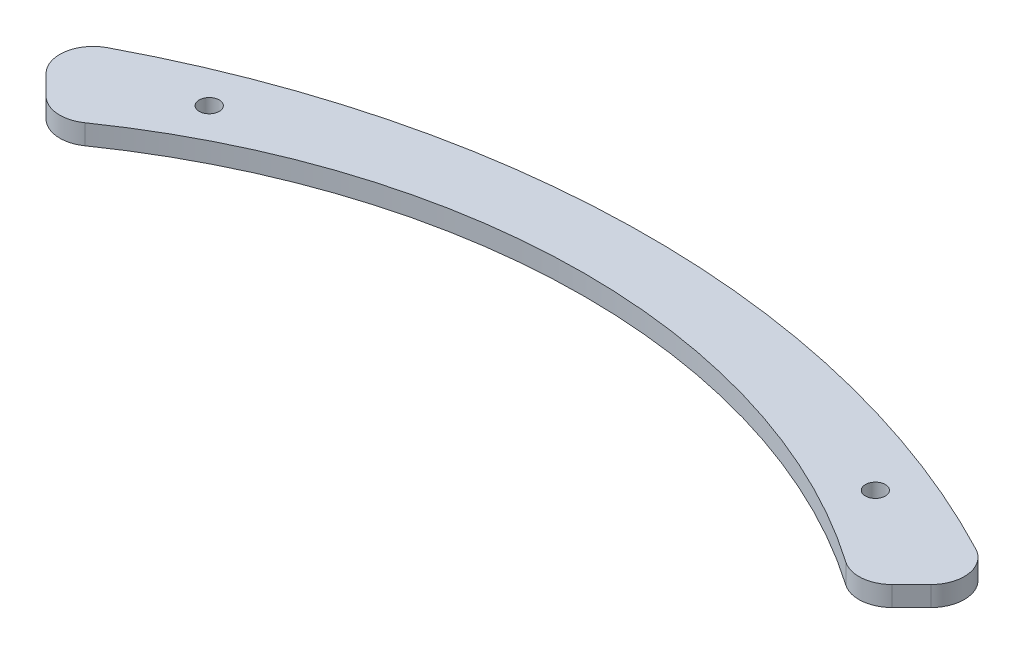
ISO-10303-21;
HEADER;
FILE_DESCRIPTION(('STEP AP214'),'2;1');
FILE_NAME('part.step','',(''),(''),'','','');
FILE_SCHEMA(('AUTOMOTIVE_DESIGN { 1 0 10303 214 1 1 1 1 }'));
ENDSEC;
DATA;
#1=APPLICATION_CONTEXT('core data for automotive mechanical design processes');
#2=APPLICATION_PROTOCOL_DEFINITION('international standard','automotive_design',2000,#1);
#3=PRODUCT_CONTEXT('',#1,'mechanical');
#4=PRODUCT('Part','Part','',(#3));
#5=PRODUCT_RELATED_PRODUCT_CATEGORY('part','',(#4));
#6=PRODUCT_DEFINITION_FORMATION('','',#4);
#7=PRODUCT_DEFINITION_CONTEXT('part definition',#1,'design');
#8=PRODUCT_DEFINITION('design','',#6,#7);
#9=PRODUCT_DEFINITION_SHAPE('','',#8);
#10=(LENGTH_UNIT() NAMED_UNIT(*) SI_UNIT(.MILLI.,.METRE.));
#11=(NAMED_UNIT(*) PLANE_ANGLE_UNIT() SI_UNIT($,.RADIAN.));
#12=(NAMED_UNIT(*) SI_UNIT($,.STERADIAN.) SOLID_ANGLE_UNIT());
#13=UNCERTAINTY_MEASURE_WITH_UNIT(LENGTH_MEASURE(1.E-05),#10,'distance_accuracy_value','');
#14=(GEOMETRIC_REPRESENTATION_CONTEXT(3) GLOBAL_UNCERTAINTY_ASSIGNED_CONTEXT((#13)) GLOBAL_UNIT_ASSIGNED_CONTEXT((#10,
#11,#12)) REPRESENTATION_CONTEXT('',''));
#15=CARTESIAN_POINT('',(0.,0.,0.));
#16=DIRECTION('',(0.,0.,1.));
#17=DIRECTION('',(1.,0.,0.));
#18=AXIS2_PLACEMENT_3D('',#15,#16,#17);
#19=CARTESIAN_POINT('',(0.,3.,0.));
#20=DIRECTION('',(0.,-1.,0.));
#21=DIRECTION('',(0.,0.,-1.));
#22=AXIS2_PLACEMENT_3D('',#19,#20,#21);
#23=CYLINDRICAL_SURFACE('',#22,140.);
#24=CARTESIAN_POINT('',(0.,3.,0.));
#25=DIRECTION('',(0.,1.,0.));
#26=DIRECTION('',(0.,0.,-1.));
#27=AXIS2_PLACEMENT_3D('',#24,#25,#26);
#28=CIRCLE('',#27,140.);
#29=CARTESIAN_POINT('',(65.2178503372049,3.,-123.881524035644));
#30=VERTEX_POINT('',#29);
#31=CARTESIAN_POINT('',(-65.2178503372049,3.,-123.881524035644));
#32=VERTEX_POINT('',#31);
#33=EDGE_CURVE('E119',#30,#32,#28,.T.);
#34=ORIENTED_EDGE('',*,*,#33,.F.);
#35=DIRECTION('',(0.,-1.,0.));
#36=VECTOR('',#35,1.);
#37=CARTESIAN_POINT('',(65.2178503372049,3.,-123.881524035644));
#38=LINE('',#37,#36);
#39=CARTESIAN_POINT('',(65.2178503372049,0.,-123.881524035644));
#40=VERTEX_POINT('',#39);
#41=EDGE_CURVE('E104',#30,#40,#38,.T.);
#42=ORIENTED_EDGE('',*,*,#41,.T.);
#43=CARTESIAN_POINT('',(0.,0.,0.));
#44=DIRECTION('',(0.,1.,0.));
#45=DIRECTION('',(0.,0.,-1.));
#46=AXIS2_PLACEMENT_3D('',#43,#44,#45);
#47=CIRCLE('',#46,140.);
#48=CARTESIAN_POINT('',(-65.2178503372049,0.,-123.881524035644));
#49=VERTEX_POINT('',#48);
#50=EDGE_CURVE('E116',#40,#49,#47,.T.);
#51=ORIENTED_EDGE('',*,*,#50,.T.);
#52=DIRECTION('',(0.,-1.,0.));
#53=VECTOR('',#52,1.);
#54=CARTESIAN_POINT('',(-65.2178503372049,3.,-123.881524035644));
#55=LINE('',#54,#53);
#56=EDGE_CURVE('E121',#49,#32,#55,.F.);
#57=ORIENTED_EDGE('',*,*,#56,.T.);
#58=EDGE_LOOP('',(#34,#42,#51,#57));
#59=FACE_BOUND('',#58,.T.);
#60=ADVANCED_FACE('F33',(#59),#23,.T.);
#61=CARTESIAN_POINT('',(-71.1027102218749,3.,-120.600184904933));
#62=DIRECTION('',(0.707106781186547,0.,-0.707106781186548));
#63=DIRECTION('',(-0.707106781186548,0.,-0.707106781186547));
#64=AXIS2_PLACEMENT_3D('',#61,#62,#63);
#65=PLANE('',#64);
#66=DIRECTION('',(0.707106781186548,0.,0.707106781186547));
#67=VECTOR('',#66,1.);
#68=CARTESIAN_POINT('',(-71.1027102218749,3.,-120.600184904933));
#69=LINE('',#68,#67);
#70=CARTESIAN_POINT('',(-66.4241753025232,3.,-115.921649985581));
#71=VERTEX_POINT('',#70);
#72=CARTESIAN_POINT('',(-63.5166538241196,3.,-113.014128507178));
#73=VERTEX_POINT('',#72);
#74=EDGE_CURVE('E163',#71,#73,#69,.T.);
#75=ORIENTED_EDGE('',*,*,#74,.F.);
#76=DIRECTION('',(0.,-1.,0.));
#77=VECTOR('',#76,1.);
#78=CARTESIAN_POINT('',(-66.4241753025232,3.,-115.921649985581));
#79=LINE('',#78,#77);
#80=CARTESIAN_POINT('',(-66.4241753025232,0.,-115.921649985581));
#81=VERTEX_POINT('',#80);
#82=EDGE_CURVE('E11',#71,#81,#79,.T.);
#83=ORIENTED_EDGE('',*,*,#82,.T.);
#84=DIRECTION('',(0.707106781186548,0.,0.707106781186547));
#85=VECTOR('',#84,1.);
#86=CARTESIAN_POINT('',(-71.1027102218749,0.,-120.600184904933));
#87=LINE('',#86,#85);
#88=CARTESIAN_POINT('',(-63.5166538241196,0.,-113.014128507178));
#89=VERTEX_POINT('',#88);
#90=EDGE_CURVE('E126',#81,#89,#87,.T.);
#91=ORIENTED_EDGE('',*,*,#90,.T.);
#92=DIRECTION('',(0.,-1.,0.));
#93=VECTOR('',#92,1.);
#94=CARTESIAN_POINT('',(-63.5166538241196,3.,-113.014128507178));
#95=LINE('',#94,#93);
#96=EDGE_CURVE('E41',#89,#73,#95,.F.);
#97=ORIENTED_EDGE('',*,*,#96,.T.);
#98=EDGE_LOOP('',(#75,#83,#91,#97));
#99=FACE_BOUND('',#98,.T.);
#100=ADVANCED_FACE('F162',(#99),#65,.F.);
#101=CARTESIAN_POINT('',(0.,3.,-30.3680793842517));
#102=DIRECTION('',(0.,-1.,0.));
#103=DIRECTION('',(0.,0.,-1.));
#104=AXIS2_PLACEMENT_3D('',#101,#102,#103);
#105=CYLINDRICAL_SURFACE('',#104,100.);
#106=CARTESIAN_POINT('',(0.,0.,-30.3680793842517));
#107=DIRECTION('',(0.,-1.,0.));
#108=DIRECTION('',(0.,0.,-1.));
#109=AXIS2_PLACEMENT_3D('',#106,#107,#108);
#110=CIRCLE('',#109,100.);
#111=CARTESIAN_POINT('',(-57.1248761125589,0.,-112.445777506974));
#112=VERTEX_POINT('',#111);
#113=CARTESIAN_POINT('',(57.1248761125589,0.,-112.445777506974));
#114=VERTEX_POINT('',#113);
#115=EDGE_CURVE('E130',#112,#114,#110,.T.);
#116=ORIENTED_EDGE('',*,*,#115,.T.);
#117=DIRECTION('',(0.,-1.,0.));
#118=VECTOR('',#117,1.);
#119=CARTESIAN_POINT('',(57.1248761125589,3.,-112.445777506974));
#120=LINE('',#119,#118);
#121=CARTESIAN_POINT('',(57.1248761125589,3.,-112.445777506974));
#122=VERTEX_POINT('',#121);
#123=EDGE_CURVE('E48',#114,#122,#120,.F.);
#124=ORIENTED_EDGE('',*,*,#123,.T.);
#125=CARTESIAN_POINT('',(0.,3.,-30.3680793842517));
#126=DIRECTION('',(0.,-1.,0.));
#127=DIRECTION('',(0.,0.,-1.));
#128=AXIS2_PLACEMENT_3D('',#125,#126,#127);
#129=CIRCLE('',#128,100.);
#130=CARTESIAN_POINT('',(-57.1248761125589,3.,-112.445777506974));
#131=VERTEX_POINT('',#130);
#132=EDGE_CURVE('E169',#131,#122,#129,.T.);
#133=ORIENTED_EDGE('',*,*,#132,.F.);
#134=DIRECTION('',(0.,-1.,0.));
#135=VECTOR('',#134,1.);
#136=CARTESIAN_POINT('',(-57.1248761125589,3.,-112.445777506974));
#137=LINE('',#136,#135);
#138=EDGE_CURVE('E156',#131,#112,#137,.T.);
#139=ORIENTED_EDGE('',*,*,#138,.T.);
#140=EDGE_LOOP('',(#116,#124,#133,#139));
#141=FACE_BOUND('',#140,.T.);
#142=ADVANCED_FACE('F173',(#141),#105,.F.);
#143=CARTESIAN_POINT('',(71.1027102218749,3.,-120.600184904933));
#144=DIRECTION('',(-0.707106781186548,0.,-0.707106781186547));
#145=DIRECTION('',(-0.707106781186547,0.,0.707106781186548));
#146=AXIS2_PLACEMENT_3D('',#143,#144,#145);
#147=PLANE('',#146);
#148=DIRECTION('',(0.707106781186547,0.,-0.707106781186548));
#149=VECTOR('',#148,1.);
#150=CARTESIAN_POINT('',(71.1027102218749,0.,-120.600184904933));
#151=LINE('',#150,#149);
#152=CARTESIAN_POINT('',(63.5166538241195,0.,-113.014128507178));
#153=VERTEX_POINT('',#152);
#154=CARTESIAN_POINT('',(66.4241753025231,0.,-115.921649985582));
#155=VERTEX_POINT('',#154);
#156=EDGE_CURVE('E140',#153,#155,#151,.T.);
#157=ORIENTED_EDGE('',*,*,#156,.T.);
#158=DIRECTION('',(0.,-1.,0.));
#159=VECTOR('',#158,1.);
#160=CARTESIAN_POINT('',(66.4241753025231,3.,-115.921649985582));
#161=LINE('',#160,#159);
#162=CARTESIAN_POINT('',(66.4241753025231,3.,-115.921649985582));
#163=VERTEX_POINT('',#162);
#164=EDGE_CURVE('E105',#155,#163,#161,.F.);
#165=ORIENTED_EDGE('',*,*,#164,.T.);
#166=DIRECTION('',(0.707106781186547,0.,-0.707106781186548));
#167=VECTOR('',#166,1.);
#168=CARTESIAN_POINT('',(71.1027102218749,3.,-120.600184904933));
#169=LINE('',#168,#167);
#170=CARTESIAN_POINT('',(63.5166538241195,3.,-113.014128507178));
#171=VERTEX_POINT('',#170);
#172=EDGE_CURVE('E136',#171,#163,#169,.T.);
#173=ORIENTED_EDGE('',*,*,#172,.F.);
#174=DIRECTION('',(0.,-1.,0.));
#175=VECTOR('',#174,1.);
#176=CARTESIAN_POINT('',(63.5166538241195,3.,-113.014128507178));
#177=LINE('',#176,#175);
#178=EDGE_CURVE('E110',#171,#153,#177,.T.);
#179=ORIENTED_EDGE('',*,*,#178,.T.);
#180=EDGE_LOOP('',(#157,#165,#173,#179));
#181=FACE_BOUND('',#180,.T.);
#182=ADVANCED_FACE('F180',(#181),#147,.F.);
#183=CARTESIAN_POINT('',(0.,3.,0.));
#184=DIRECTION('',(0.,-1.,0.));
#185=DIRECTION('',(0.,0.,-1.));
#186=AXIS2_PLACEMENT_3D('',#183,#184,#185);
#187=PLANE('',#186);
#188=CARTESIAN_POINT('',(50.,3.,-124.));
#189=DIRECTION('',(0.,1.,0.));
#190=DIRECTION('',(0.,0.,1.));
#191=AXIS2_PLACEMENT_3D('',#188,#189,#190);
#192=CIRCLE('',#191,1.5);
#193=CARTESIAN_POINT('',(50.,3.,-122.5));
#194=VERTEX_POINT('',#193);
#195=EDGE_CURVE('E184',#194,#194,#192,.T.);
#196=ORIENTED_EDGE('',*,*,#195,.F.);
#197=EDGE_LOOP('',(#196));
#198=FACE_BOUND('',#197,.T.);
#199=CARTESIAN_POINT('',(-50.,3.,-124.));
#200=DIRECTION('',(0.,1.,0.));
#201=DIRECTION('',(0.,0.,1.));
#202=AXIS2_PLACEMENT_3D('',#199,#200,#201);
#203=CIRCLE('',#202,1.5);
#204=CARTESIAN_POINT('',(-50.,3.,-122.5));
#205=VERTEX_POINT('',#204);
#206=EDGE_CURVE('E127',#205,#205,#203,.T.);
#207=ORIENTED_EDGE('',*,*,#206,.F.);
#208=EDGE_LOOP('',(#207));
#209=FACE_BOUND('',#208,.T.);
#210=ORIENTED_EDGE('',*,*,#172,.T.);
#211=CARTESIAN_POINT('',(62.8886413965904,3.,-119.457183891514));
#212=DIRECTION('',(0.,-1.,0.));
#213=DIRECTION('',(0.,0.,-1.));
#214=AXIS2_PLACEMENT_3D('',#211,#212,#213);
#215=CIRCLE('',#214,5.);
#216=EDGE_CURVE('E154',#163,#30,#215,.F.);
#217=ORIENTED_EDGE('',*,*,#216,.T.);
#218=ORIENTED_EDGE('',*,*,#33,.T.);
#219=CARTESIAN_POINT('',(-62.8886413965904,3.,-119.457183891514));
#220=DIRECTION('',(0.,-1.,0.));
#221=DIRECTION('',(0.,0.,-1.));
#222=AXIS2_PLACEMENT_3D('',#219,#220,#221);
#223=CIRCLE('',#222,5.);
#224=EDGE_CURVE('E150',#32,#71,#223,.F.);
#225=ORIENTED_EDGE('',*,*,#224,.T.);
#226=ORIENTED_EDGE('',*,*,#74,.T.);
#227=CARTESIAN_POINT('',(-59.9811199181868,3.,-116.549662413111));
#228=DIRECTION('',(0.,-1.,0.));
#229=DIRECTION('',(0.,0.,-1.));
#230=AXIS2_PLACEMENT_3D('',#227,#228,#229);
#231=CIRCLE('',#230,5.);
#232=EDGE_CURVE('E55',#73,#131,#231,.F.);
#233=ORIENTED_EDGE('',*,*,#232,.T.);
#234=ORIENTED_EDGE('',*,*,#132,.T.);
#235=CARTESIAN_POINT('',(59.9811199181868,3.,-116.549662413111));
#236=DIRECTION('',(0.,-1.,0.));
#237=DIRECTION('',(0.,0.,-1.));
#238=AXIS2_PLACEMENT_3D('',#235,#236,#237);
#239=CIRCLE('',#238,5.);
#240=EDGE_CURVE('E152',#122,#171,#239,.F.);
#241=ORIENTED_EDGE('',*,*,#240,.T.);
#242=EDGE_LOOP('',(#210,#217,#218,#225,#226,#233,#234,#241));
#243=FACE_BOUND('',#242,.T.);
#244=ADVANCED_FACE('F167',(#198,#209,#243),#187,.F.);
#245=CARTESIAN_POINT('',(0.,0.,0.));
#246=DIRECTION('',(0.,-1.,0.));
#247=DIRECTION('',(0.,0.,-1.));
#248=AXIS2_PLACEMENT_3D('',#245,#246,#247);
#249=PLANE('',#248);
#250=CARTESIAN_POINT('',(50.,0.,-124.));
#251=DIRECTION('',(0.,-1.,0.));
#252=DIRECTION('',(0.,0.,-1.));
#253=AXIS2_PLACEMENT_3D('',#250,#251,#252);
#254=CIRCLE('',#253,1.5);
#255=CARTESIAN_POINT('',(50.,0.,-122.5));
#256=VERTEX_POINT('',#255);
#257=EDGE_CURVE('E186',#256,#256,#254,.F.);
#258=ORIENTED_EDGE('',*,*,#257,.T.);
#259=EDGE_LOOP('',(#258));
#260=FACE_BOUND('',#259,.T.);
#261=CARTESIAN_POINT('',(-50.,0.,-124.));
#262=DIRECTION('',(0.,-1.,0.));
#263=DIRECTION('',(0.,0.,-1.));
#264=AXIS2_PLACEMENT_3D('',#261,#262,#263);
#265=CIRCLE('',#264,1.5);
#266=CARTESIAN_POINT('',(-50.,0.,-122.5));
#267=VERTEX_POINT('',#266);
#268=EDGE_CURVE('E133',#267,#267,#265,.F.);
#269=ORIENTED_EDGE('',*,*,#268,.T.);
#270=EDGE_LOOP('',(#269));
#271=FACE_BOUND('',#270,.T.);
#272=ORIENTED_EDGE('',*,*,#50,.F.);
#273=CARTESIAN_POINT('',(62.8886413965904,0.,-119.457183891514));
#274=DIRECTION('',(0.,-1.,0.));
#275=DIRECTION('',(0.,0.,-1.));
#276=AXIS2_PLACEMENT_3D('',#273,#274,#275);
#277=CIRCLE('',#276,5.);
#278=EDGE_CURVE('E100',#40,#155,#277,.T.);
#279=ORIENTED_EDGE('',*,*,#278,.T.);
#280=ORIENTED_EDGE('',*,*,#156,.F.);
#281=CARTESIAN_POINT('',(59.9811199181868,0.,-116.549662413111));
#282=DIRECTION('',(0.,-1.,0.));
#283=DIRECTION('',(0.,0.,-1.));
#284=AXIS2_PLACEMENT_3D('',#281,#282,#283);
#285=CIRCLE('',#284,5.);
#286=EDGE_CURVE('E111',#153,#114,#285,.T.);
#287=ORIENTED_EDGE('',*,*,#286,.T.);
#288=ORIENTED_EDGE('',*,*,#115,.F.);
#289=CARTESIAN_POINT('',(-59.9811199181868,0.,-116.549662413111));
#290=DIRECTION('',(0.,-1.,0.));
#291=DIRECTION('',(0.,0.,-1.));
#292=AXIS2_PLACEMENT_3D('',#289,#290,#291);
#293=CIRCLE('',#292,5.);
#294=EDGE_CURVE('E120',#112,#89,#293,.T.);
#295=ORIENTED_EDGE('',*,*,#294,.T.);
#296=ORIENTED_EDGE('',*,*,#90,.F.);
#297=CARTESIAN_POINT('',(-62.8886413965904,0.,-119.457183891514));
#298=DIRECTION('',(0.,-1.,0.));
#299=DIRECTION('',(0.,0.,-1.));
#300=AXIS2_PLACEMENT_3D('',#297,#298,#299);
#301=CIRCLE('',#300,5.);
#302=EDGE_CURVE('E125',#81,#49,#301,.T.);
#303=ORIENTED_EDGE('',*,*,#302,.T.);
#304=EDGE_LOOP('',(#272,#279,#280,#287,#288,#295,#296,#303));
#305=FACE_BOUND('',#304,.T.);
#306=ADVANCED_FACE('F123',(#260,#271,#305),#249,.T.);
#307=CARTESIAN_POINT('',(62.8886413965904,3.,-119.457183891514));
#308=DIRECTION('',(0.,-1.,0.));
#309=DIRECTION('',(0.,0.,-1.));
#310=AXIS2_PLACEMENT_3D('',#307,#308,#309);
#311=CYLINDRICAL_SURFACE('',#310,5.);
#312=ORIENTED_EDGE('',*,*,#216,.F.);
#313=ORIENTED_EDGE('',*,*,#164,.F.);
#314=ORIENTED_EDGE('',*,*,#278,.F.);
#315=ORIENTED_EDGE('',*,*,#41,.F.);
#316=EDGE_LOOP('',(#312,#313,#314,#315));
#317=FACE_BOUND('',#316,.T.);
#318=ADVANCED_FACE('F103',(#317),#311,.T.);
#319=CARTESIAN_POINT('',(59.9811199181868,3.,-116.549662413111));
#320=DIRECTION('',(0.,-1.,0.));
#321=DIRECTION('',(0.,0.,-1.));
#322=AXIS2_PLACEMENT_3D('',#319,#320,#321);
#323=CYLINDRICAL_SURFACE('',#322,5.);
#324=ORIENTED_EDGE('',*,*,#240,.F.);
#325=ORIENTED_EDGE('',*,*,#123,.F.);
#326=ORIENTED_EDGE('',*,*,#286,.F.);
#327=ORIENTED_EDGE('',*,*,#178,.F.);
#328=EDGE_LOOP('',(#324,#325,#326,#327));
#329=FACE_BOUND('',#328,.T.);
#330=ADVANCED_FACE('F177',(#329),#323,.T.);
#331=CARTESIAN_POINT('',(-62.8886413965904,3.,-119.457183891514));
#332=DIRECTION('',(0.,-1.,0.));
#333=DIRECTION('',(0.,0.,-1.));
#334=AXIS2_PLACEMENT_3D('',#331,#332,#333);
#335=CYLINDRICAL_SURFACE('',#334,5.);
#336=ORIENTED_EDGE('',*,*,#224,.F.);
#337=ORIENTED_EDGE('',*,*,#56,.F.);
#338=ORIENTED_EDGE('',*,*,#302,.F.);
#339=ORIENTED_EDGE('',*,*,#82,.F.);
#340=EDGE_LOOP('',(#336,#337,#338,#339));
#341=FACE_BOUND('',#340,.T.);
#342=ADVANCED_FACE('F209',(#341),#335,.T.);
#343=CARTESIAN_POINT('',(-59.9811199181868,3.,-116.549662413111));
#344=DIRECTION('',(0.,-1.,0.));
#345=DIRECTION('',(0.,0.,-1.));
#346=AXIS2_PLACEMENT_3D('',#343,#344,#345);
#347=CYLINDRICAL_SURFACE('',#346,5.);
#348=ORIENTED_EDGE('',*,*,#232,.F.);
#349=ORIENTED_EDGE('',*,*,#96,.F.);
#350=ORIENTED_EDGE('',*,*,#294,.F.);
#351=ORIENTED_EDGE('',*,*,#138,.F.);
#352=EDGE_LOOP('',(#348,#349,#350,#351));
#353=FACE_BOUND('',#352,.T.);
#354=ADVANCED_FACE('F35',(#353),#347,.T.);
#355=CARTESIAN_POINT('',(-50.,-0.00100000000000013,-124.));
#356=DIRECTION('',(0.,1.,0.));
#357=DIRECTION('',(0.,0.,1.));
#358=AXIS2_PLACEMENT_3D('',#355,#356,#357);
#359=CYLINDRICAL_SURFACE('',#358,1.5);
#360=CARTESIAN_POINT('',(-50.,0.,-122.5));
#361=CARTESIAN_POINT('',(-50.,0.03125,-122.5));
#362=CARTESIAN_POINT('',(-50.,0.0625,-122.5));
#363=CARTESIAN_POINT('',(-50.,0.125,-122.5));
#364=CARTESIAN_POINT('',(-50.,0.15625,-122.5));
#365=CARTESIAN_POINT('',(-50.,0.21875,-122.5));
#366=CARTESIAN_POINT('',(-50.,0.25,-122.5));
#367=CARTESIAN_POINT('',(-50.,0.3125,-122.5));
#368=CARTESIAN_POINT('',(-50.,0.34375,-122.5));
#369=CARTESIAN_POINT('',(-50.,0.40625,-122.5));
#370=CARTESIAN_POINT('',(-50.,0.4375,-122.5));
#371=CARTESIAN_POINT('',(-50.,0.5,-122.5));
#372=CARTESIAN_POINT('',(-50.,0.53125,-122.5));
#373=CARTESIAN_POINT('',(-50.,0.59375,-122.5));
#374=CARTESIAN_POINT('',(-50.,0.625,-122.5));
#375=CARTESIAN_POINT('',(-50.,0.6875,-122.5));
#376=CARTESIAN_POINT('',(-50.,0.71875,-122.5));
#377=CARTESIAN_POINT('',(-50.,0.78125,-122.5));
#378=CARTESIAN_POINT('',(-50.,0.8125,-122.5));
#379=CARTESIAN_POINT('',(-50.,0.875,-122.5));
#380=CARTESIAN_POINT('',(-50.,0.90625,-122.5));
#381=CARTESIAN_POINT('',(-50.,0.96875,-122.5));
#382=CARTESIAN_POINT('',(-50.,1.,-122.5));
#383=CARTESIAN_POINT('',(-50.,1.0625,-122.5));
#384=CARTESIAN_POINT('',(-50.,1.09375,-122.5));
#385=CARTESIAN_POINT('',(-50.,1.15625,-122.5));
#386=CARTESIAN_POINT('',(-50.,1.1875,-122.5));
#387=CARTESIAN_POINT('',(-50.,1.25,-122.5));
#388=CARTESIAN_POINT('',(-50.,1.28125,-122.5));
#389=CARTESIAN_POINT('',(-50.,1.34375,-122.5));
#390=CARTESIAN_POINT('',(-50.,1.375,-122.5));
#391=CARTESIAN_POINT('',(-50.,1.4375,-122.5));
#392=CARTESIAN_POINT('',(-50.,1.46875,-122.5));
#393=CARTESIAN_POINT('',(-50.,1.53125,-122.5));
#394=CARTESIAN_POINT('',(-50.,1.5625,-122.5));
#395=CARTESIAN_POINT('',(-50.,1.625,-122.5));
#396=CARTESIAN_POINT('',(-50.,1.65625,-122.5));
#397=CARTESIAN_POINT('',(-50.,1.71875,-122.5));
#398=CARTESIAN_POINT('',(-50.,1.75,-122.5));
#399=CARTESIAN_POINT('',(-50.,1.8125,-122.5));
#400=CARTESIAN_POINT('',(-50.,1.84375,-122.5));
#401=CARTESIAN_POINT('',(-50.,1.90625,-122.5));
#402=CARTESIAN_POINT('',(-50.,1.9375,-122.5));
#403=CARTESIAN_POINT('',(-50.,2.,-122.5));
#404=CARTESIAN_POINT('',(-50.,2.03125,-122.5));
#405=CARTESIAN_POINT('',(-50.,2.09375,-122.5));
#406=CARTESIAN_POINT('',(-50.,2.125,-122.5));
#407=CARTESIAN_POINT('',(-50.,2.1875,-122.5));
#408=CARTESIAN_POINT('',(-50.,2.21875,-122.5));
#409=CARTESIAN_POINT('',(-50.,2.28125,-122.5));
#410=CARTESIAN_POINT('',(-50.,2.3125,-122.5));
#411=CARTESIAN_POINT('',(-50.,2.375,-122.5));
#412=CARTESIAN_POINT('',(-50.,2.40625,-122.5));
#413=CARTESIAN_POINT('',(-50.,2.46875,-122.5));
#414=CARTESIAN_POINT('',(-50.,2.5,-122.5));
#415=CARTESIAN_POINT('',(-50.,2.5625,-122.5));
#416=CARTESIAN_POINT('',(-50.,2.59375,-122.5));
#417=CARTESIAN_POINT('',(-50.,2.65625,-122.5));
#418=CARTESIAN_POINT('',(-50.,2.6875,-122.5));
#419=CARTESIAN_POINT('',(-50.,2.75,-122.5));
#420=CARTESIAN_POINT('',(-50.,2.78125,-122.5));
#421=CARTESIAN_POINT('',(-50.,2.84375,-122.5));
#422=CARTESIAN_POINT('',(-50.,2.875,-122.5));
#423=CARTESIAN_POINT('',(-50.,2.9375,-122.5));
#424=CARTESIAN_POINT('',(-50.,2.96875,-122.5));
#425=CARTESIAN_POINT('',(-50.,3.,-122.5));
#426=B_SPLINE_CURVE_WITH_KNOTS('',3,(#360,#361,#362,#363,#364,#365,#366,#367,#368,#369,#370,
#371,#372,#373,#374,#375,#376,#377,#378,#379,#380,#381,#382,#383,#384,#385,#386,#387,#388,#389,
#390,#391,#392,#393,#394,#395,#396,#397,#398,#399,#400,#401,#402,#403,#404,#405,#406,#407,#408,
#409,#410,#411,#412,#413,#414,#415,#416,#417,#418,#419,#420,#421,#422,#423,#424,#425),
.UNSPECIFIED.,.F.,.F.,(4,2,2,2,2,2,2,2,2,2,2,2,2,2,2,2,2,2,2,2,2,2,2,2,2,2,2,2,2,2,2,2,4),(0.,
0.09375,0.1875,0.28125,0.375,0.46875,0.5625,0.65625,0.75,0.84375,0.9375,1.03125,1.125,1.21875,
1.3125,1.40625,1.5,1.59375,1.6875,1.78125,1.875,1.96875,2.0625,2.15625,2.25,2.34375,2.4375,
2.53125,2.625,2.71875,2.8125,2.90625,3.),.UNSPECIFIED.);
#427=EDGE_CURVE('BSEAM199',#267,#205,#426,.T.);
#428=ORIENTED_EDGE('',*,*,#268,.F.);
#429=ORIENTED_EDGE('',*,*,#206,.T.);
#430=ORIENTED_EDGE('',*,*,#427,.T.);
#431=ORIENTED_EDGE('',*,*,#427,.F.);
#432=EDGE_LOOP('',(#428,#430,#429,#431));
#433=FACE_BOUND('',#432,.T.);
#434=ADVANCED_FACE('F199',(#433),#359,.F.);
#435=CARTESIAN_POINT('',(50.,-0.00100000000000013,-124.));
#436=DIRECTION('',(0.,1.,0.));
#437=DIRECTION('',(0.,0.,1.));
#438=AXIS2_PLACEMENT_3D('',#435,#436,#437);
#439=CYLINDRICAL_SURFACE('',#438,1.5);
#440=CARTESIAN_POINT('',(50.,0.,-122.5));
#441=CARTESIAN_POINT('',(50.,0.03125,-122.5));
#442=CARTESIAN_POINT('',(50.,0.0625,-122.5));
#443=CARTESIAN_POINT('',(50.,0.125,-122.5));
#444=CARTESIAN_POINT('',(50.,0.15625,-122.5));
#445=CARTESIAN_POINT('',(50.,0.21875,-122.5));
#446=CARTESIAN_POINT('',(50.,0.25,-122.5));
#447=CARTESIAN_POINT('',(50.,0.3125,-122.5));
#448=CARTESIAN_POINT('',(50.,0.34375,-122.5));
#449=CARTESIAN_POINT('',(50.,0.40625,-122.5));
#450=CARTESIAN_POINT('',(50.,0.4375,-122.5));
#451=CARTESIAN_POINT('',(50.,0.5,-122.5));
#452=CARTESIAN_POINT('',(50.,0.53125,-122.5));
#453=CARTESIAN_POINT('',(50.,0.59375,-122.5));
#454=CARTESIAN_POINT('',(50.,0.625,-122.5));
#455=CARTESIAN_POINT('',(50.,0.6875,-122.5));
#456=CARTESIAN_POINT('',(50.,0.71875,-122.5));
#457=CARTESIAN_POINT('',(50.,0.78125,-122.5));
#458=CARTESIAN_POINT('',(50.,0.8125,-122.5));
#459=CARTESIAN_POINT('',(50.,0.875,-122.5));
#460=CARTESIAN_POINT('',(50.,0.90625,-122.5));
#461=CARTESIAN_POINT('',(50.,0.96875,-122.5));
#462=CARTESIAN_POINT('',(50.,1.,-122.5));
#463=CARTESIAN_POINT('',(50.,1.0625,-122.5));
#464=CARTESIAN_POINT('',(50.,1.09375,-122.5));
#465=CARTESIAN_POINT('',(50.,1.15625,-122.5));
#466=CARTESIAN_POINT('',(50.,1.1875,-122.5));
#467=CARTESIAN_POINT('',(50.,1.25,-122.5));
#468=CARTESIAN_POINT('',(50.,1.28125,-122.5));
#469=CARTESIAN_POINT('',(50.,1.34375,-122.5));
#470=CARTESIAN_POINT('',(50.,1.375,-122.5));
#471=CARTESIAN_POINT('',(50.,1.4375,-122.5));
#472=CARTESIAN_POINT('',(50.,1.46875,-122.5));
#473=CARTESIAN_POINT('',(50.,1.53125,-122.5));
#474=CARTESIAN_POINT('',(50.,1.5625,-122.5));
#475=CARTESIAN_POINT('',(50.,1.625,-122.5));
#476=CARTESIAN_POINT('',(50.,1.65625,-122.5));
#477=CARTESIAN_POINT('',(50.,1.71875,-122.5));
#478=CARTESIAN_POINT('',(50.,1.75,-122.5));
#479=CARTESIAN_POINT('',(50.,1.8125,-122.5));
#480=CARTESIAN_POINT('',(50.,1.84375,-122.5));
#481=CARTESIAN_POINT('',(50.,1.90625,-122.5));
#482=CARTESIAN_POINT('',(50.,1.9375,-122.5));
#483=CARTESIAN_POINT('',(50.,2.,-122.5));
#484=CARTESIAN_POINT('',(50.,2.03125,-122.5));
#485=CARTESIAN_POINT('',(50.,2.09375,-122.5));
#486=CARTESIAN_POINT('',(50.,2.125,-122.5));
#487=CARTESIAN_POINT('',(50.,2.1875,-122.5));
#488=CARTESIAN_POINT('',(50.,2.21875,-122.5));
#489=CARTESIAN_POINT('',(50.,2.28125,-122.5));
#490=CARTESIAN_POINT('',(50.,2.3125,-122.5));
#491=CARTESIAN_POINT('',(50.,2.375,-122.5));
#492=CARTESIAN_POINT('',(50.,2.40625,-122.5));
#493=CARTESIAN_POINT('',(50.,2.46875,-122.5));
#494=CARTESIAN_POINT('',(50.,2.5,-122.5));
#495=CARTESIAN_POINT('',(50.,2.5625,-122.5));
#496=CARTESIAN_POINT('',(50.,2.59375,-122.5));
#497=CARTESIAN_POINT('',(50.,2.65625,-122.5));
#498=CARTESIAN_POINT('',(50.,2.6875,-122.5));
#499=CARTESIAN_POINT('',(50.,2.75,-122.5));
#500=CARTESIAN_POINT('',(50.,2.78125,-122.5));
#501=CARTESIAN_POINT('',(50.,2.84375,-122.5));
#502=CARTESIAN_POINT('',(50.,2.875,-122.5));
#503=CARTESIAN_POINT('',(50.,2.9375,-122.5));
#504=CARTESIAN_POINT('',(50.,2.96875,-122.5));
#505=CARTESIAN_POINT('',(50.,3.,-122.5));
#506=B_SPLINE_CURVE_WITH_KNOTS('',3,(#440,#441,#442,#443,#444,#445,#446,#447,#448,#449,#450,
#451,#452,#453,#454,#455,#456,#457,#458,#459,#460,#461,#462,#463,#464,#465,#466,#467,#468,#469,
#470,#471,#472,#473,#474,#475,#476,#477,#478,#479,#480,#481,#482,#483,#484,#485,#486,#487,#488,
#489,#490,#491,#492,#493,#494,#495,#496,#497,#498,#499,#500,#501,#502,#503,#504,#505),
.UNSPECIFIED.,.F.,.F.,(4,2,2,2,2,2,2,2,2,2,2,2,2,2,2,2,2,2,2,2,2,2,2,2,2,2,2,2,2,2,2,2,4),(0.,
0.09375,0.1875,0.28125,0.375,0.46875,0.5625,0.65625,0.75,0.84375,0.9375,1.03125,1.125,1.21875,
1.3125,1.40625,1.5,1.59375,1.6875,1.78125,1.875,1.96875,2.0625,2.15625,2.25,2.34375,2.4375,
2.53125,2.625,2.71875,2.8125,2.90625,3.),.UNSPECIFIED.);
#507=EDGE_CURVE('BSEAM192',#256,#194,#506,.T.);
#508=ORIENTED_EDGE('',*,*,#257,.F.);
#509=ORIENTED_EDGE('',*,*,#195,.T.);
#510=ORIENTED_EDGE('',*,*,#507,.T.);
#511=ORIENTED_EDGE('',*,*,#507,.F.);
#512=EDGE_LOOP('',(#508,#510,#509,#511));
#513=FACE_BOUND('',#512,.T.);
#514=ADVANCED_FACE('F192',(#513),#439,.F.);
#515=CLOSED_SHELL('',(#60,#100,#142,#182,#244,#306,#318,#330,#342,#354,#434,#514));
#516=MANIFOLD_SOLID_BREP('B2',#515);
#517=ADVANCED_BREP_SHAPE_REPRESENTATION('',(#18,#516),#14);
#518=SHAPE_DEFINITION_REPRESENTATION(#9,#517);
ENDSEC;
END-ISO-10303-21;
